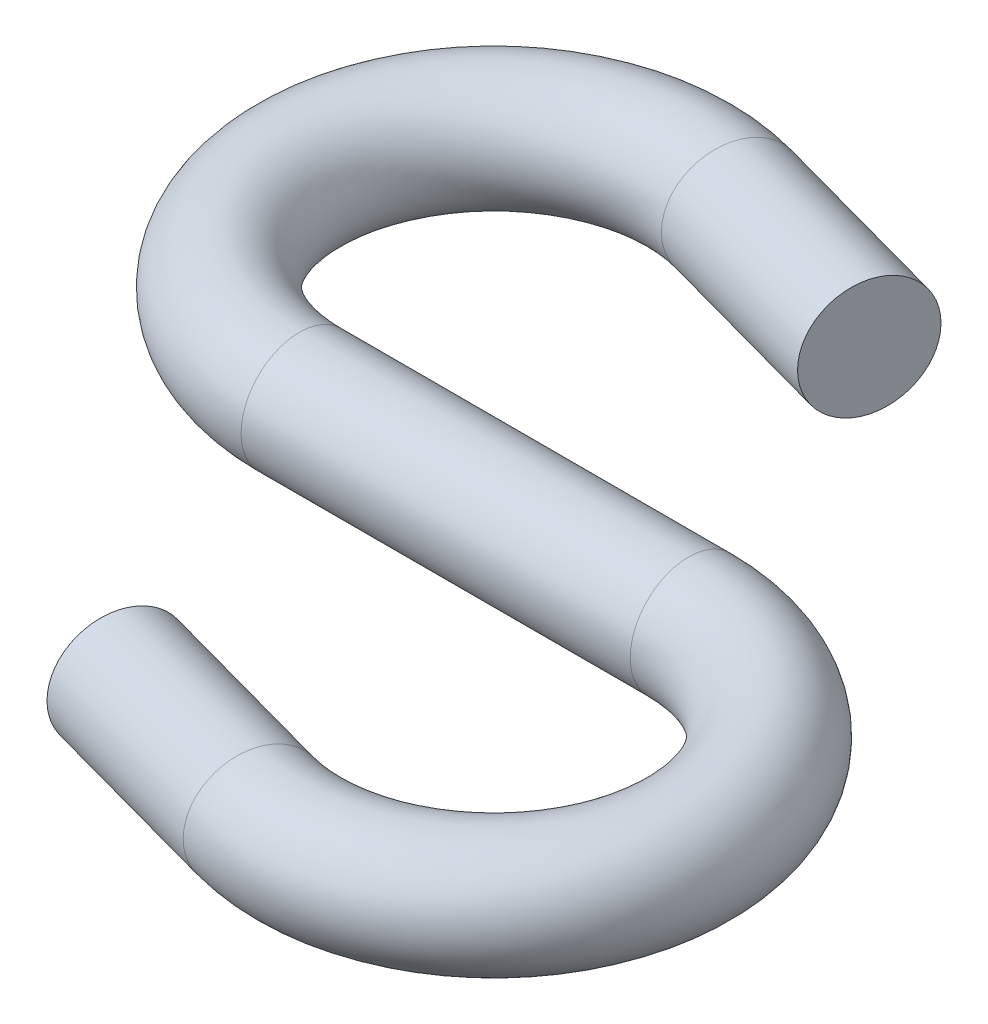
ISO-10303-21;
HEADER;
FILE_DESCRIPTION(('STEP AP214'),'2;1');
FILE_NAME('part.step','',(''),(''),'','','');
FILE_SCHEMA(('AUTOMOTIVE_DESIGN { 1 0 10303 214 1 1 1 1 }'));
ENDSEC;
DATA;
#1=APPLICATION_CONTEXT('core data for automotive mechanical design processes');
#2=APPLICATION_PROTOCOL_DEFINITION('international standard','automotive_design',2000,#1);
#3=PRODUCT_CONTEXT('',#1,'mechanical');
#4=PRODUCT('Part','Part','',(#3));
#5=PRODUCT_RELATED_PRODUCT_CATEGORY('part','',(#4));
#6=PRODUCT_DEFINITION_FORMATION('','',#4);
#7=PRODUCT_DEFINITION_CONTEXT('part definition',#1,'design');
#8=PRODUCT_DEFINITION('design','',#6,#7);
#9=PRODUCT_DEFINITION_SHAPE('','',#8);
#10=(LENGTH_UNIT() NAMED_UNIT(*) SI_UNIT(.MILLI.,.METRE.));
#11=(NAMED_UNIT(*) PLANE_ANGLE_UNIT() SI_UNIT($,.RADIAN.));
#12=(NAMED_UNIT(*) SI_UNIT($,.STERADIAN.) SOLID_ANGLE_UNIT());
#13=UNCERTAINTY_MEASURE_WITH_UNIT(LENGTH_MEASURE(1.E-05),#10,'distance_accuracy_value','');
#14=(GEOMETRIC_REPRESENTATION_CONTEXT(3) GLOBAL_UNCERTAINTY_ASSIGNED_CONTEXT((#13)) GLOBAL_UNIT_ASSIGNED_CONTEXT((#10,
#11,#12)) REPRESENTATION_CONTEXT('',''));
#15=CARTESIAN_POINT('',(0.,0.,0.));
#16=DIRECTION('',(0.,0.,1.));
#17=DIRECTION('',(1.,0.,0.));
#18=AXIS2_PLACEMENT_3D('',#15,#16,#17);
#19=CARTESIAN_POINT('',(3.6325265923185,0.,-26.9874999999999));
#20=DIRECTION('',(-0.964410286372226,0.,-0.264410286372224));
#21=DIRECTION('',(-0.264410286372224,0.,0.964410286372226));
#22=AXIS2_PLACEMENT_3D('',#19,#20,#21);
#23=PLANE('',#22);
#24=CARTESIAN_POINT('',(3.6325265923185,0.,-26.9874999999999));
#25=DIRECTION('',(-0.964410286372226,0.,-0.264410286372224));
#26=DIRECTION('',(-0.264410286372224,0.,0.964410286372226));
#27=AXIS2_PLACEMENT_3D('',#24,#25,#26);
#28=CIRCLE('',#27,4.7625);
#29=CARTESIAN_POINT('',(2.37327260347078,0.,-22.3944960111522));
#30=VERTEX_POINT('',#29);
#31=EDGE_CURVE('E10',#30,#30,#28,.T.);
#32=ORIENTED_EDGE('',*,*,#31,.F.);
#33=EDGE_LOOP('',(#32));
#34=FACE_BOUND('',#33,.T.);
#35=ADVANCED_FACE('F40',(#34),#23,.F.);
#36=CARTESIAN_POINT('',(0.,0.,0.));
#37=DIRECTION('',(-1.,0.,0.));
#38=DIRECTION('',(0.,0.,1.));
#39=AXIS2_PLACEMENT_3D('',#36,#37,#38);
#40=CYLINDRICAL_SURFACE('',#39,4.7625);
#41=CARTESIAN_POINT('',(-15.8749999999998,0.,0.));
#42=DIRECTION('',(1.,0.,0.));
#43=DIRECTION('',(0.,0.,-1.));
#44=AXIS2_PLACEMENT_3D('',#41,#42,#43);
#45=CIRCLE('',#44,4.7625);
#46=CARTESIAN_POINT('',(-15.8749999999998,0.,4.76249999999969));
#47=VERTEX_POINT('',#46);
#48=EDGE_CURVE('E54',#47,#47,#45,.T.);
#49=ORIENTED_EDGE('',*,*,#48,.T.);
#50=EDGE_LOOP('',(#49));
#51=FACE_BOUND('',#50,.T.);
#52=CARTESIAN_POINT('',(15.8750000000002,0.,0.));
#53=DIRECTION('',(-1.,0.,0.));
#54=DIRECTION('',(0.,0.,1.));
#55=AXIS2_PLACEMENT_3D('',#52,#53,#54);
#56=CIRCLE('',#55,4.7625);
#57=CARTESIAN_POINT('',(15.8750000000002,0.,-4.76249999999992));
#58=VERTEX_POINT('',#57);
#59=EDGE_CURVE('E71',#58,#58,#56,.T.);
#60=ORIENTED_EDGE('',*,*,#59,.T.);
#61=EDGE_LOOP('',(#60));
#62=FACE_BOUND('',#61,.T.);
#63=ADVANCED_FACE('F78',(#51,#62),#40,.T.);
#64=CARTESIAN_POINT('',(-15.8749999999998,0.,-15.8750000000003));
#65=DIRECTION('',(0.,-1.,0.));
#66=DIRECTION('',(0.,0.,-1.));
#67=AXIS2_PLACEMENT_3D('',#64,#65,#66);
#68=TOROIDAL_SURFACE('',#67,15.875,4.7625);
#69=CARTESIAN_POINT('',(-11.6774867038407,0.,-31.1850132961591));
#70=DIRECTION('',(-0.964410286372227,0.,-0.264410286372224));
#71=DIRECTION('',(-0.264410286372224,0.,0.964410286372227));
#72=AXIS2_PLACEMENT_3D('',#69,#70,#71);
#73=CIRCLE('',#72,4.7625);
#74=CARTESIAN_POINT('',(-10.4182327149929,0.,-35.7780172850071));
#75=VERTEX_POINT('',#74);
#76=EDGE_CURVE('E47',#75,#75,#73,.T.);
#77=CARTESIAN_POINT('',(-15.8749999999998,0.,-15.8750000000003));
#78=DIRECTION('',(0.,-1.,0.));
#79=DIRECTION('',(0.,0.,-1.));
#80=AXIS2_PLACEMENT_3D('',#77,#78,#79);
#81=CIRCLE('',#80,20.6375);
#82=EDGE_CURVE('',#47,#75,#81,.T.);
#83=ORIENTED_EDGE('',*,*,#48,.F.);
#84=ORIENTED_EDGE('',*,*,#76,.T.);
#85=ORIENTED_EDGE('',*,*,#82,.T.);
#86=ORIENTED_EDGE('',*,*,#82,.F.);
#87=EDGE_LOOP('',(#83,#85,#84,#86));
#88=FACE_BOUND('',#87,.T.);
#89=ADVANCED_FACE('F96',(#88),#68,.T.);
#90=CARTESIAN_POINT('',(-11.6774867038407,0.,-31.1850132961591));
#91=DIRECTION('',(0.964410286372226,0.,0.264410286372224));
#92=DIRECTION('',(0.264410286372224,0.,-0.964410286372227));
#93=AXIS2_PLACEMENT_3D('',#90,#91,#92);
#94=CYLINDRICAL_SURFACE('',#93,4.7625);
#95=ORIENTED_EDGE('',*,*,#31,.T.);
#96=EDGE_LOOP('',(#95));
#97=FACE_BOUND('',#96,.T.);
#98=ORIENTED_EDGE('',*,*,#76,.F.);
#99=EDGE_LOOP('',(#98));
#100=FACE_BOUND('',#99,.T.);
#101=ADVANCED_FACE('F92',(#97,#100),#94,.T.);
#102=CARTESIAN_POINT('',(-3.63252659231805,0.,26.9874999999999));
#103=DIRECTION('',(0.964410286372226,0.,0.264410286372224));
#104=DIRECTION('',(0.264410286372224,0.,-0.964410286372226));
#105=AXIS2_PLACEMENT_3D('',#102,#103,#104);
#106=PLANE('',#105);
#107=CARTESIAN_POINT('',(-3.63252659231805,0.,26.9874999999999));
#108=DIRECTION('',(0.964410286372226,0.,0.264410286372224));
#109=DIRECTION('',(0.264410286372224,0.,-0.964410286372226));
#110=AXIS2_PLACEMENT_3D('',#107,#108,#109);
#111=CIRCLE('',#110,4.7625);
#112=CARTESIAN_POINT('',(-2.37327260347034,0.,22.3944960111522));
#113=VERTEX_POINT('',#112);
#114=EDGE_CURVE('E61',#113,#113,#111,.T.);
#115=ORIENTED_EDGE('',*,*,#114,.F.);
#116=EDGE_LOOP('',(#115));
#117=FACE_BOUND('',#116,.T.);
#118=ADVANCED_FACE('F83',(#117),#106,.F.);
#119=CARTESIAN_POINT('',(15.8750000000002,0.,15.8750000000001));
#120=DIRECTION('',(0.,-1.,0.));
#121=DIRECTION('',(0.,0.,-1.));
#122=AXIS2_PLACEMENT_3D('',#119,#120,#121);
#123=TOROIDAL_SURFACE('',#122,15.875,4.7625);
#124=CARTESIAN_POINT('',(11.6774867038412,0.,31.1850132961595));
#125=DIRECTION('',(0.964410286372227,0.,0.264410286372224));
#126=DIRECTION('',(0.264410286372224,0.,-0.964410286372227));
#127=AXIS2_PLACEMENT_3D('',#124,#125,#126);
#128=CIRCLE('',#127,4.7625);
#129=CARTESIAN_POINT('',(10.4182327149936,0.,35.7780172850069));
#130=VERTEX_POINT('',#129);
#131=EDGE_CURVE('E67',#130,#130,#128,.T.);
#132=CARTESIAN_POINT('',(15.8750000000002,0.,15.8750000000001));
#133=DIRECTION('',(0.,-1.,0.));
#134=DIRECTION('',(0.,0.,-1.));
#135=AXIS2_PLACEMENT_3D('',#132,#133,#134);
#136=CIRCLE('',#135,20.6375);
#137=EDGE_CURVE('',#58,#130,#136,.T.);
#138=ORIENTED_EDGE('',*,*,#59,.F.);
#139=ORIENTED_EDGE('',*,*,#131,.T.);
#140=ORIENTED_EDGE('',*,*,#137,.T.);
#141=ORIENTED_EDGE('',*,*,#137,.F.);
#142=EDGE_LOOP('',(#138,#140,#139,#141));
#143=FACE_BOUND('',#142,.T.);
#144=ADVANCED_FACE('F80',(#143),#123,.T.);
#145=CARTESIAN_POINT('',(11.6774867038412,0.,31.1850132961595));
#146=DIRECTION('',(-0.964410286372226,0.,-0.264410286372224));
#147=DIRECTION('',(-0.264410286372224,0.,0.964410286372227));
#148=AXIS2_PLACEMENT_3D('',#145,#146,#147);
#149=CYLINDRICAL_SURFACE('',#148,4.7625);
#150=ORIENTED_EDGE('',*,*,#114,.T.);
#151=EDGE_LOOP('',(#150));
#152=FACE_BOUND('',#151,.T.);
#153=ORIENTED_EDGE('',*,*,#131,.F.);
#154=EDGE_LOOP('',(#153));
#155=FACE_BOUND('',#154,.T.);
#156=ADVANCED_FACE('F82',(#152,#155),#149,.T.);
#157=CLOSED_SHELL('',(#35,#63,#89,#101,#118,#144,#156));
#158=MANIFOLD_SOLID_BREP('B2',#157);
#159=ADVANCED_BREP_SHAPE_REPRESENTATION('',(#18,#158),#14);
#160=SHAPE_DEFINITION_REPRESENTATION(#9,#159);
ENDSEC;
END-ISO-10303-21;
